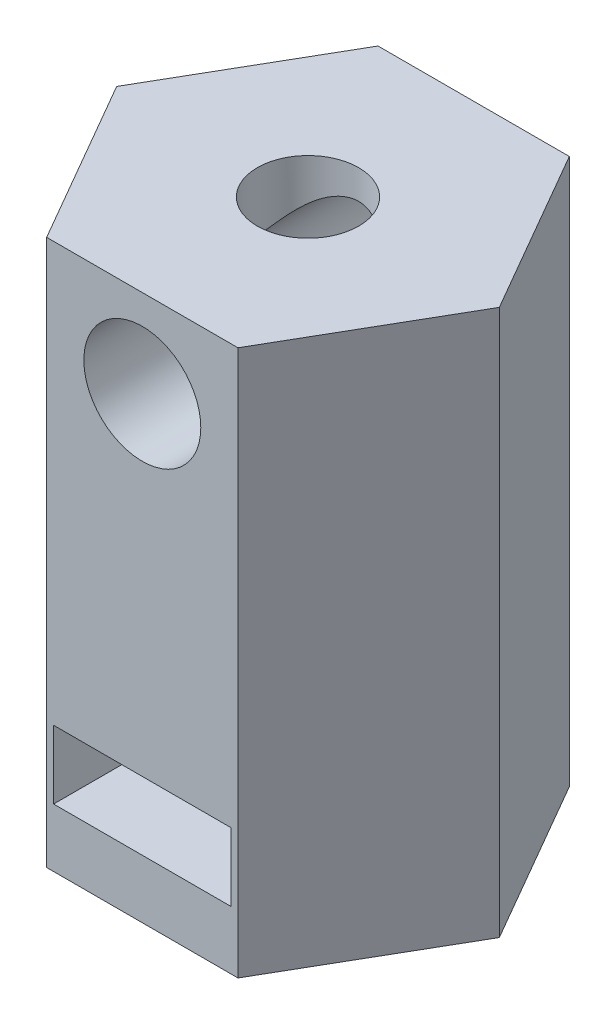
ISO-10303-21;
HEADER;
FILE_DESCRIPTION(('STEP AP214'),'2;1');
FILE_NAME('part.step','',(''),(''),'','','');
FILE_SCHEMA(('AUTOMOTIVE_DESIGN { 1 0 10303 214 1 1 1 1 }'));
ENDSEC;
DATA;
#1=APPLICATION_CONTEXT('core data for automotive mechanical design processes');
#2=APPLICATION_PROTOCOL_DEFINITION('international standard','automotive_design',2000,#1);
#3=PRODUCT_CONTEXT('',#1,'mechanical');
#4=PRODUCT('Part','Part','',(#3));
#5=PRODUCT_RELATED_PRODUCT_CATEGORY('part','',(#4));
#6=PRODUCT_DEFINITION_FORMATION('','',#4);
#7=PRODUCT_DEFINITION_CONTEXT('part definition',#1,'design');
#8=PRODUCT_DEFINITION('design','',#6,#7);
#9=PRODUCT_DEFINITION_SHAPE('','',#8);
#10=(LENGTH_UNIT() NAMED_UNIT(*) SI_UNIT(.MILLI.,.METRE.));
#11=(NAMED_UNIT(*) PLANE_ANGLE_UNIT() SI_UNIT($,.RADIAN.));
#12=(NAMED_UNIT(*) SI_UNIT($,.STERADIAN.) SOLID_ANGLE_UNIT());
#13=UNCERTAINTY_MEASURE_WITH_UNIT(LENGTH_MEASURE(1.E-05),#10,'distance_accuracy_value','');
#14=(GEOMETRIC_REPRESENTATION_CONTEXT(3) GLOBAL_UNCERTAINTY_ASSIGNED_CONTEXT((#13)) GLOBAL_UNIT_ASSIGNED_CONTEXT((#10,
#11,#12)) REPRESENTATION_CONTEXT('',''));
#15=CARTESIAN_POINT('',(0.,0.,0.));
#16=DIRECTION('',(0.,0.,1.));
#17=DIRECTION('',(1.,0.,0.));
#18=AXIS2_PLACEMENT_3D('',#15,#16,#17);
#19=CARTESIAN_POINT('',(0.,28.,0.));
#20=DIRECTION('',(0.,-1.,0.));
#21=DIRECTION('',(0.,0.,-1.));
#22=AXIS2_PLACEMENT_3D('',#19,#20,#21);
#23=CYLINDRICAL_SURFACE('',#22,2.6);
#24=CARTESIAN_POINT('',(0.,26.5,-2.6));
#25=CARTESIAN_POINT('',(-0.122036811911643,26.4999961523859,-2.59999607606496));
#26=CARTESIAN_POINT('',(-0.244101537045012,26.4924900820522,-2.59134552516133));
#27=CARTESIAN_POINT('',(-0.484127000017196,26.4631528928743,-2.55740997887854));
#28=CARTESIAN_POINT('',(-0.602084922512981,26.4413121431353,-2.53211379994141));
#29=CARTESIAN_POINT('',(-0.829866081116416,26.3853092315215,-2.46683775590036));
#30=CARTESIAN_POINT('',(-0.939734258164139,26.3512224955164,-2.42694775054569));
#31=CARTESIAN_POINT('',(-1.15015054999408,26.2730447018292,-2.33460467545643));
#32=CARTESIAN_POINT('',(-1.25069514169639,26.2289498839413,-2.28214688337876));
#33=CARTESIAN_POINT('',(-1.47814182146978,26.1147494458661,-2.14450925368009));
#34=CARTESIAN_POINT('',(-1.60035911156059,26.0411546657277,-2.05449642324004));
#35=CARTESIAN_POINT('',(-1.82474074899083,25.8851716629069,-1.85813586683931));
#36=CARTESIAN_POINT('',(-1.92685025277362,25.8027603116058,-1.75174483852135));
#37=CARTESIAN_POINT('',(-2.06588706446538,25.6762721420018,-1.58039907303505));
#38=CARTESIAN_POINT('',(-2.11027231109694,25.6331555689501,-1.52062164767831));
#39=CARTESIAN_POINT('',(-2.19381958043996,25.5471306649954,-1.39739017362985));
#40=CARTESIAN_POINT('',(-2.23298332831771,25.5042222698485,-1.33393734926688));
#41=CARTESIAN_POINT('',(-2.30597975143278,25.4197825944302,-1.20334745364668));
#42=CARTESIAN_POINT('',(-2.33982146591621,25.3782490758539,-1.13621689624653));
#43=CARTESIAN_POINT('',(-2.4020563874559,25.2979710521381,-0.997932683108461));
#44=CARTESIAN_POINT('',(-2.43045390156697,25.2592243575578,-0.926782265773632));
#45=CARTESIAN_POINT('',(-2.48252110005695,25.1849997471733,-0.776945271034018));
#46=CARTESIAN_POINT('',(-2.50594314761147,25.1497265292691,-0.698067910628427));
#47=CARTESIAN_POINT('',(-2.54566233665675,25.0877542814534,-0.535334760517547));
#48=CARTESIAN_POINT('',(-2.56197470284398,25.0610369628014,-0.451490049960404));
#49=CARTESIAN_POINT('',(-2.58459644103562,25.0232479644642,-0.292130938413231));
#50=CARTESIAN_POINT('',(-2.59202281255669,25.0104551268924,-0.217200819597414));
#51=CARTESIAN_POINT('',(-2.60026317871865,24.9962317803682,-0.0659355939648666));
#52=CARTESIAN_POINT('',(-2.60108539831342,24.9947871381768,0.0103976465192853));
#53=CARTESIAN_POINT('',(-2.59605461273043,25.0035016614558,0.162042756173804));
#54=CARTESIAN_POINT('',(-2.59020960526932,25.0136469242006,0.237355739641685));
#55=CARTESIAN_POINT('',(-2.57238021411883,25.0437484263959,0.385272909372081));
#56=CARTESIAN_POINT('',(-2.56038422559565,25.0637232079644,0.45787169607294));
#57=CARTESIAN_POINT('',(-2.52147903531039,25.1260972561526,0.645246938196866));
#58=CARTESIAN_POINT('',(-2.48994215789256,25.1746461258717,0.756961059524094));
#59=CARTESIAN_POINT('',(-2.41449561129592,25.2817234160631,0.971185557909345));
#60=CARTESIAN_POINT('',(-2.37053454874882,25.3402928815609,1.07365532204548));
#61=CARTESIAN_POINT('',(-2.28293622382989,25.4472574242365,1.24709941814335));
#62=CARTESIAN_POINT('',(-2.24165840973019,25.4948023326594,1.31980988955533));
#63=CARTESIAN_POINT('',(-2.15257193120331,25.5906278447395,1.46061089235828));
#64=CARTESIAN_POINT('',(-2.10476000509473,25.6389088050553,1.52869909084659));
#65=CARTESIAN_POINT('',(-1.95165590608276,25.7826634596901,1.72589684522945));
#66=CARTESIAN_POINT('',(-1.83651100797697,25.8772879238855,1.84830351352665));
#67=CARTESIAN_POINT('',(-1.61070902380854,26.0337235924693,2.04507047616997));
#68=CARTESIAN_POINT('',(-1.50560401122592,26.0979604036507,2.12391195012331));
#69=CARTESIAN_POINT('',(-1.28045955493203,26.2159694098807,2.26674289844214));
#70=CARTESIAN_POINT('',(-1.16044481833302,26.2697585484603,2.33075645304022));
#71=CARTESIAN_POINT('',(-0.929631725819047,26.3544881829195,2.43077509150827));
#72=CARTESIAN_POINT('',(-0.82099019255538,26.3877909054414,2.46973666437996));
#73=CARTESIAN_POINT('',(-0.596655087209226,26.4423276095791,2.53329060881113));
#74=CARTESIAN_POINT('',(-0.480965687482502,26.4635686563204,2.55789139243867));
#75=CARTESIAN_POINT('',(-0.245040719158137,26.4923456231244,2.59117793218758));
#76=CARTESIAN_POINT('',(-0.124786462895931,26.499817156763,2.59978892123352));
#77=CARTESIAN_POINT('',(0.115770972832734,26.5001760700907,2.60020326358588));
#78=CARTESIAN_POINT('',(0.236074146389205,26.4930648710206,2.59200825481378));
#79=CARTESIAN_POINT('',(0.463734828946009,26.4659908197691,2.56069448317498));
#80=CARTESIAN_POINT('',(0.571382384377745,26.4470430239618,2.53875407596919));
#81=CARTESIAN_POINT('',(0.780816061633671,26.3986014543223,2.48235729167675));
#82=CARTESIAN_POINT('',(0.882601175698396,26.3691058735604,2.44789877010923));
#83=CARTESIAN_POINT('',(1.08633193047631,26.2986422912813,2.36493538779857));
#84=CARTESIAN_POINT('',(1.18766127581577,26.2569547418623,2.31553932000514));
#85=CARTESIAN_POINT('',(1.38044374994752,26.165667928357,2.20605736786414));
#86=CARTESIAN_POINT('',(1.47188978885318,26.1160630470503,2.14596389035855));
#87=CARTESIAN_POINT('',(1.68888962334431,25.9841454608477,1.98350955968552));
#88=CARTESIAN_POINT('',(1.80786024470882,25.8981125849307,1.87528505482315));
#89=CARTESIAN_POINT('',(1.96864914876693,25.7647982796664,1.7002142562044));
#90=CARTESIAN_POINT('',(2.01937227503802,25.7195685554882,1.63962072239826));
#91=CARTESIAN_POINT('',(2.11496472200616,25.6286790912018,1.51430660737665));
#92=CARTESIAN_POINT('',(2.15983583253699,25.5830194871746,1.44958729708488));
#93=CARTESIAN_POINT('',(2.26850274418227,25.4655720858524,1.27658515611242));
#94=CARTESIAN_POINT('',(2.32786777471195,25.3942437665507,1.16510618877216));
#95=CARTESIAN_POINT('',(2.40522462408719,25.2935180885053,0.989422604012071));
#96=CARTESIAN_POINT('',(2.42904453903465,25.2610154945768,0.929512026686933));
#97=CARTESIAN_POINT('',(2.4725834993528,25.1993374633802,0.806587789475439));
#98=CARTESIAN_POINT('',(2.49230544031223,25.1701596834592,0.743576359826611));
#99=CARTESIAN_POINT('',(2.53010726734419,25.1124302973177,0.603823235786282));
#100=CARTESIAN_POINT('',(2.54741291906392,25.0847341310855,0.526503182326674));
#101=CARTESIAN_POINT('',(2.57509707486093,25.0393483416129,0.367863353352812));
#102=CARTESIAN_POINT('',(2.58549351631859,25.0216328254308,0.286554527990548));
#103=CARTESIAN_POINT('',(2.59855162561494,24.9992406415943,0.120478843716785));
#104=CARTESIAN_POINT('',(2.60112488116834,24.9947130384846,0.035683356176975));
#105=CARTESIAN_POINT('',(2.59795894640532,25.000203879138,-0.133291620194751));
#106=CARTESIAN_POINT('',(2.59221412281563,25.0102321806436,-0.217470652729842));
#107=CARTESIAN_POINT('',(2.57150348761926,25.0452584232481,-0.395891345486222));
#108=CARTESIAN_POINT('',(2.55518081870153,25.0724402758467,-0.48952128155744));
#109=CARTESIAN_POINT('',(2.51369807406109,25.1379283381528,-0.670852440277273));
#110=CARTESIAN_POINT('',(2.48850536070318,25.1762755397311,-0.758530321270102));
#111=CARTESIAN_POINT('',(2.43458226033522,25.2534849576656,-0.915798064655637));
#112=CARTESIAN_POINT('',(2.40687488243175,25.2914872739783,-0.986180314054116));
#113=CARTESIAN_POINT('',(2.34615428073661,25.3703037901942,-1.12301711282146));
#114=CARTESIAN_POINT('',(2.31313741923828,25.4111199068945,-1.18946892631223));
#115=CARTESIAN_POINT('',(2.24195527814326,25.4941496776773,-1.31874368824279));
#116=CARTESIAN_POINT('',(2.20378444829093,25.5363648008347,-1.38156261883852));
#117=CARTESIAN_POINT('',(2.12236520461423,25.6210898516541,-1.50364607092495));
#118=CARTESIAN_POINT('',(2.07911489134335,25.6635998839688,-1.56290925016452));
#119=CARTESIAN_POINT('',(1.98473519901748,25.7505972505061,-1.68133825932973));
#120=CARTESIAN_POINT('',(1.93328650493916,25.7950474789669,-1.74027868074778));
#121=CARTESIAN_POINT('',(1.82465588334032,25.882330954277,-1.85386502907448));
#122=CARTESIAN_POINT('',(1.76747380252788,25.9251641578501,-1.90851084108968));
#123=CARTESIAN_POINT('',(1.58744653263397,26.0497446078029,-2.06524649958812));
#124=CARTESIAN_POINT('',(1.45578594346458,26.1278942645975,-2.16056006403859));
#125=CARTESIAN_POINT('',(1.21182900479209,26.246668651675,-2.30330981800929));
#126=CARTESIAN_POINT('',(1.10502365217341,26.2915985533629,-2.35661013477298));
#127=CARTESIAN_POINT('',(0.881479556423296,26.3700094476502,-2.44899129880215));
#128=CARTESIAN_POINT('',(0.764753256733738,26.4035045253584,-2.48808964350416));
#129=CARTESIAN_POINT('',(0.540726854893215,26.452775309116,-2.54540014295299));
#130=CARTESIAN_POINT('',(0.434379058625082,26.4703694997917,-2.56576321666613));
#131=CARTESIAN_POINT('',(0.218694609505881,26.4939825008899,-2.59306366427572));
#132=CARTESIAN_POINT('',(0.109358512116181,26.5000034478888,-2.60000351628079));
#133=CARTESIAN_POINT('',(0.,26.5,-2.6));
#134=B_SPLINE_CURVE_WITH_KNOTS('',3,(#24,#25,#26,#27,#28,#29,#30,#31,#32,#33,#34,#35,#36,#37,
#38,#39,#40,#41,#42,#43,#44,#45,#46,#47,#48,#49,#50,#51,#52,#53,#54,#55,#56,#57,#58,#59,#60,#61,
#62,#63,#64,#65,#66,#67,#68,#69,#70,#71,#72,#73,#74,#75,#76,#77,#78,#79,#80,#81,#82,#83,#84,#85,
#86,#87,#88,#89,#90,#91,#92,#93,#94,#95,#96,#97,#98,#99,#100,#101,#102,#103,#104,#105,#106,#107,
#108,#109,#110,#111,#112,#113,#114,#115,#116,#117,#118,#119,#120,#121,#122,#123,#124,#125,#126,
#127,#128,#129,#130,#131,#132,#133),.UNSPECIFIED.,.T.,.F.,(4,2,2,2,2,2,2,2,2,2,2,2,2,2,2,2,2,2,
2,2,2,2,2,2,2,2,2,2,2,2,2,2,2,2,2,2,2,2,2,2,2,2,2,2,2,2,2,2,2,2,2,2,2,2,4),(0.,
0.365646957931043,0.731539831178044,1.09521667155394,1.45903037833673,1.96240661583991,
2.46713734287795,2.72506015258748,2.9828975331327,3.24029214474588,3.49748227649525,
3.76543730322217,4.03281567667182,4.26093801331194,4.48877619733048,4.7163413636911,
4.94433745747789,5.31967409934263,5.69658665767118,5.98478048554274,6.27311870234818,
6.84839261924972,7.28563702665712,7.72216630054766,8.0810612540919,8.43974576752274,
8.80010327992169,9.16042567335502,9.49343452539856,9.82650045218281,10.1857472196171,
10.545250009235,11.0892661384051,11.362206680241,11.635063546703,12.068718971492,
12.2851321650344,12.5013919191732,12.7524329798693,13.0028197262048,13.2560258459834,
13.5094035253937,13.8043050336667,14.1003031817671,14.3539197242193,14.6077107741024,
14.8617773417602,15.1159392206265,15.3855685776396,15.6552051455788,16.192611835933,
16.5738507362008,16.9546183277948,17.2823390441132,17.6099992529697),.UNSPECIFIED.);
#135=CARTESIAN_POINT('',(0.,26.5,-2.6));
#136=VERTEX_POINT('',#135);
#137=EDGE_CURVE('E193',#136,#136,#134,.T.);
#138=ORIENTED_EDGE('',*,*,#137,.F.);
#139=EDGE_LOOP('',(#138));
#140=FACE_BOUND('',#139,.T.);
#141=CARTESIAN_POINT('',(0.,28.,0.));
#142=DIRECTION('',(0.,1.,0.));
#143=DIRECTION('',(0.,0.,1.));
#144=AXIS2_PLACEMENT_3D('',#141,#142,#143);
#145=CIRCLE('',#144,2.6);
#146=CARTESIAN_POINT('',(0.,28.,2.6));
#147=VERTEX_POINT('',#146);
#148=EDGE_CURVE('E189',#147,#147,#145,.T.);
#149=ORIENTED_EDGE('',*,*,#148,.T.);
#150=EDGE_LOOP('',(#149));
#151=FACE_BOUND('',#150,.T.);
#152=ADVANCED_FACE('F63',(#140,#151),#23,.F.);
#153=CARTESIAN_POINT('',(-4.90747728811182,11.,8.5));
#154=DIRECTION('',(0.,0.,-1.));
#155=DIRECTION('',(-1.,0.,0.));
#156=AXIS2_PLACEMENT_3D('',#153,#154,#155);
#157=PLANE('',#156);
#158=CARTESIAN_POINT('',(0.,23.5,8.5));
#159=DIRECTION('',(0.,0.,1.));
#160=DIRECTION('',(1.,0.,0.));
#161=AXIS2_PLACEMENT_3D('',#158,#159,#160);
#162=CIRCLE('',#161,3.);
#163=CARTESIAN_POINT('',(3.,23.5,8.5));
#164=VERTEX_POINT('',#163);
#165=EDGE_CURVE('E182',#164,#164,#162,.T.);
#166=ORIENTED_EDGE('',*,*,#165,.F.);
#167=EDGE_LOOP('',(#166));
#168=FACE_BOUND('',#167,.T.);
#169=DIRECTION('',(1.,0.,0.));
#170=VECTOR('',#169,1.);
#171=CARTESIAN_POINT('',(-4.90747728811182,0.,8.5));
#172=LINE('',#171,#170);
#173=CARTESIAN_POINT('',(-4.90747728811182,0.,8.5));
#174=VERTEX_POINT('',#173);
#175=CARTESIAN_POINT('',(4.90747728811182,0.,8.5));
#176=VERTEX_POINT('',#175);
#177=EDGE_CURVE('E248',#174,#176,#172,.T.);
#178=ORIENTED_EDGE('',*,*,#177,.T.);
#179=DIRECTION('',(0.,-1.,0.));
#180=VECTOR('',#179,1.);
#181=CARTESIAN_POINT('',(4.90747728811182,11.,8.5));
#182=LINE('',#181,#180);
#183=CARTESIAN_POINT('',(4.90747728811192,28.,8.49999999999994));
#184=VERTEX_POINT('',#183);
#185=EDGE_CURVE('E250',#184,#176,#182,.T.);
#186=ORIENTED_EDGE('',*,*,#185,.F.);
#187=DIRECTION('',(1.,0.,0.));
#188=VECTOR('',#187,1.);
#189=CARTESIAN_POINT('',(-4.90747728811174,28.,8.50000000000005));
#190=LINE('',#189,#188);
#191=CARTESIAN_POINT('',(-4.90747728811174,28.,8.50000000000005));
#192=VERTEX_POINT('',#191);
#193=EDGE_CURVE('E208',#192,#184,#190,.T.);
#194=ORIENTED_EDGE('',*,*,#193,.F.);
#195=DIRECTION('',(0.,-1.,0.));
#196=VECTOR('',#195,1.);
#197=CARTESIAN_POINT('',(-4.90747728811182,11.,8.5));
#198=LINE('',#197,#196);
#199=EDGE_CURVE('E253',#192,#174,#198,.T.);
#200=ORIENTED_EDGE('',*,*,#199,.T.);
#201=EDGE_LOOP('',(#178,#186,#194,#200));
#202=FACE_BOUND('',#201,.T.);
#203=DIRECTION('',(1.,0.,0.));
#204=VECTOR('',#203,1.);
#205=CARTESIAN_POINT('',(0.,6.5,8.5));
#206=LINE('',#205,#204);
#207=CARTESIAN_POINT('',(-4.55,6.5,8.5));
#208=VERTEX_POINT('',#207);
#209=CARTESIAN_POINT('',(4.55,6.5,8.5));
#210=VERTEX_POINT('',#209);
#211=EDGE_CURVE('E212',#208,#210,#206,.T.);
#212=ORIENTED_EDGE('',*,*,#211,.T.);
#213=DIRECTION('',(0.,1.,0.));
#214=VECTOR('',#213,1.);
#215=CARTESIAN_POINT('',(4.55,0.,8.5));
#216=LINE('',#215,#214);
#217=CARTESIAN_POINT('',(4.55,3.,8.5));
#218=VERTEX_POINT('',#217);
#219=EDGE_CURVE('E221',#218,#210,#216,.T.);
#220=ORIENTED_EDGE('',*,*,#219,.F.);
#221=DIRECTION('',(-1.,0.,0.));
#222=VECTOR('',#221,1.);
#223=CARTESIAN_POINT('',(0.,3.,8.5));
#224=LINE('',#223,#222);
#225=CARTESIAN_POINT('',(-4.55,3.,8.5));
#226=VERTEX_POINT('',#225);
#227=EDGE_CURVE('E218',#218,#226,#224,.T.);
#228=ORIENTED_EDGE('',*,*,#227,.T.);
#229=DIRECTION('',(0.,1.,0.));
#230=VECTOR('',#229,1.);
#231=CARTESIAN_POINT('',(-4.55,0.,8.5));
#232=LINE('',#231,#230);
#233=EDGE_CURVE('E215',#226,#208,#232,.T.);
#234=ORIENTED_EDGE('',*,*,#233,.T.);
#235=EDGE_LOOP('',(#212,#220,#228,#234));
#236=FACE_BOUND('',#235,.T.);
#237=ADVANCED_FACE('F306',(#168,#202,#236),#157,.F.);
#238=CARTESIAN_POINT('',(0.,11.,0.));
#239=DIRECTION('',(0.,-1.,0.));
#240=DIRECTION('',(0.,0.,-1.));
#241=AXIS2_PLACEMENT_3D('',#238,#239,#240);
#242=CYLINDRICAL_SURFACE('',#241,2.6);
#243=CARTESIAN_POINT('',(0.,11.,0.));
#244=DIRECTION('',(0.,1.,0.));
#245=DIRECTION('',(0.,0.,1.));
#246=AXIS2_PLACEMENT_3D('',#243,#244,#245);
#247=CIRCLE('',#246,2.6);
#248=CARTESIAN_POINT('',(0.,11.,2.6));
#249=VERTEX_POINT('',#248);
#250=EDGE_CURVE('E211',#249,#249,#247,.T.);
#251=ORIENTED_EDGE('',*,*,#250,.T.);
#252=EDGE_LOOP('',(#251));
#253=FACE_BOUND('',#252,.T.);
#254=CARTESIAN_POINT('',(0.,6.5,0.));
#255=DIRECTION('',(0.,-1.,0.));
#256=DIRECTION('',(1.,0.,0.));
#257=AXIS2_PLACEMENT_3D('',#254,#255,#256);
#258=CIRCLE('',#257,2.6);
#259=CARTESIAN_POINT('',(2.6,6.5,0.));
#260=VERTEX_POINT('',#259);
#261=EDGE_CURVE('E237',#260,#260,#258,.T.);
#262=ORIENTED_EDGE('',*,*,#261,.T.);
#263=EDGE_LOOP('',(#262));
#264=FACE_BOUND('',#263,.T.);
#265=ADVANCED_FACE('F311',(#253,#264),#242,.F.);
#266=CARTESIAN_POINT('',(0.,0.,0.));
#267=DIRECTION('',(0.,1.,0.));
#268=DIRECTION('',(0.,0.,1.));
#269=AXIS2_PLACEMENT_3D('',#266,#267,#268);
#270=CIRCLE('',#269,2.6);
#271=CARTESIAN_POINT('',(0.,0.,2.6));
#272=VERTEX_POINT('',#271);
#273=EDGE_CURVE('E233',#272,#272,#270,.T.);
#274=ORIENTED_EDGE('',*,*,#273,.F.);
#275=EDGE_LOOP('',(#274));
#276=FACE_BOUND('',#275,.T.);
#277=CARTESIAN_POINT('',(0.,3.,0.));
#278=DIRECTION('',(0.,1.,0.));
#279=DIRECTION('',(-1.,0.,0.));
#280=AXIS2_PLACEMENT_3D('',#277,#278,#279);
#281=CIRCLE('',#280,2.6);
#282=CARTESIAN_POINT('',(-2.6,3.,0.));
#283=VERTEX_POINT('',#282);
#284=EDGE_CURVE('E226',#283,#283,#281,.T.);
#285=ORIENTED_EDGE('',*,*,#284,.T.);
#286=EDGE_LOOP('',(#285));
#287=FACE_BOUND('',#286,.T.);
#288=ADVANCED_FACE('F360',(#276,#287),#242,.F.);
#289=CARTESIAN_POINT('',(0.,0.,0.));
#290=DIRECTION('',(0.,1.,0.));
#291=DIRECTION('',(0.,0.,1.));
#292=AXIS2_PLACEMENT_3D('',#289,#290,#291);
#293=PLANE('',#292);
#294=DIRECTION('',(0.5,0.,-0.866025403784439));
#295=VECTOR('',#294,1.);
#296=CARTESIAN_POINT('',(4.90747728811182,0.,8.5));
#297=LINE('',#296,#295);
#298=CARTESIAN_POINT('',(9.81495457622364,0.,0.));
#299=VERTEX_POINT('',#298);
#300=EDGE_CURVE('E236',#176,#299,#297,.T.);
#301=ORIENTED_EDGE('',*,*,#300,.F.);
#302=ORIENTED_EDGE('',*,*,#177,.F.);
#303=DIRECTION('',(0.5,0.,0.866025403784439));
#304=VECTOR('',#303,1.);
#305=CARTESIAN_POINT('',(-9.81495457622364,0.,0.));
#306=LINE('',#305,#304);
#307=CARTESIAN_POINT('',(-9.81495457622364,0.,0.));
#308=VERTEX_POINT('',#307);
#309=EDGE_CURVE('E246',#308,#174,#306,.T.);
#310=ORIENTED_EDGE('',*,*,#309,.F.);
#311=DIRECTION('',(-0.5,0.,0.866025403784439));
#312=VECTOR('',#311,1.);
#313=CARTESIAN_POINT('',(-4.90747728811182,0.,-8.5));
#314=LINE('',#313,#312);
#315=CARTESIAN_POINT('',(-4.90747728811182,0.,-8.5));
#316=VERTEX_POINT('',#315);
#317=EDGE_CURVE('E244',#316,#308,#314,.T.);
#318=ORIENTED_EDGE('',*,*,#317,.F.);
#319=DIRECTION('',(-1.,0.,0.));
#320=VECTOR('',#319,1.);
#321=CARTESIAN_POINT('',(4.90747728811182,0.,-8.5));
#322=LINE('',#321,#320);
#323=CARTESIAN_POINT('',(4.90747728811182,0.,-8.5));
#324=VERTEX_POINT('',#323);
#325=EDGE_CURVE('E242',#324,#316,#322,.T.);
#326=ORIENTED_EDGE('',*,*,#325,.F.);
#327=DIRECTION('',(-0.5,0.,-0.866025403784438));
#328=VECTOR('',#327,1.);
#329=CARTESIAN_POINT('',(9.81495457622364,0.,0.));
#330=LINE('',#329,#328);
#331=EDGE_CURVE('E240',#299,#324,#330,.T.);
#332=ORIENTED_EDGE('',*,*,#331,.F.);
#333=EDGE_LOOP('',(#301,#302,#310,#318,#326,#332));
#334=FACE_BOUND('',#333,.T.);
#335=ORIENTED_EDGE('',*,*,#273,.T.);
#336=EDGE_LOOP('',(#335));
#337=FACE_BOUND('',#336,.T.);
#338=ADVANCED_FACE('F362',(#334,#337),#293,.F.);
#339=CARTESIAN_POINT('',(4.90747728811182,11.,8.5));
#340=DIRECTION('',(-0.866025403784439,0.,-0.5));
#341=DIRECTION('',(-0.5,0.,0.866025403784439));
#342=AXIS2_PLACEMENT_3D('',#339,#340,#341);
#343=PLANE('',#342);
#344=ORIENTED_EDGE('',*,*,#300,.T.);
#345=DIRECTION('',(0.,-1.,0.));
#346=VECTOR('',#345,1.);
#347=CARTESIAN_POINT('',(9.81495457622364,11.,0.));
#348=LINE('',#347,#346);
#349=CARTESIAN_POINT('',(9.81495457622364,28.,0.));
#350=VERTEX_POINT('',#349);
#351=EDGE_CURVE('E265',#350,#299,#348,.T.);
#352=ORIENTED_EDGE('',*,*,#351,.F.);
#353=DIRECTION('',(0.499999999999995,0.,-0.866025403784442));
#354=VECTOR('',#353,1.);
#355=CARTESIAN_POINT('',(4.90747728811192,28.,8.49999999999994));
#356=LINE('',#355,#354);
#357=EDGE_CURVE('E192',#184,#350,#356,.T.);
#358=ORIENTED_EDGE('',*,*,#357,.F.);
#359=ORIENTED_EDGE('',*,*,#185,.T.);
#360=EDGE_LOOP('',(#344,#352,#358,#359));
#361=FACE_BOUND('',#360,.T.);
#362=ADVANCED_FACE('F65',(#361),#343,.F.);
#363=CARTESIAN_POINT('',(9.81495457622364,11.,0.));
#364=DIRECTION('',(-0.866025403784439,0.,0.5));
#365=DIRECTION('',(0.5,0.,0.866025403784439));
#366=AXIS2_PLACEMENT_3D('',#363,#364,#365);
#367=PLANE('',#366);
#368=ORIENTED_EDGE('',*,*,#331,.T.);
#369=DIRECTION('',(0.,-1.,0.));
#370=VECTOR('',#369,1.);
#371=CARTESIAN_POINT('',(4.90747728811182,11.,-8.5));
#372=LINE('',#371,#370);
#373=CARTESIAN_POINT('',(4.9074772881118,28.,-8.50000000000001));
#374=VERTEX_POINT('',#373);
#375=EDGE_CURVE('E262',#374,#324,#372,.T.);
#376=ORIENTED_EDGE('',*,*,#375,.F.);
#377=DIRECTION('',(-0.500000000000001,0.,-0.866025403784438));
#378=VECTOR('',#377,1.);
#379=CARTESIAN_POINT('',(9.81495457622364,28.,0.));
#380=LINE('',#379,#378);
#381=EDGE_CURVE('E196',#350,#374,#380,.T.);
#382=ORIENTED_EDGE('',*,*,#381,.F.);
#383=ORIENTED_EDGE('',*,*,#351,.T.);
#384=EDGE_LOOP('',(#368,#376,#382,#383));
#385=FACE_BOUND('',#384,.T.);
#386=ADVANCED_FACE('F375',(#385),#367,.F.);
#387=CARTESIAN_POINT('',(4.90747728811182,11.,-8.5));
#388=DIRECTION('',(0.,0.,1.));
#389=DIRECTION('',(1.,0.,0.));
#390=AXIS2_PLACEMENT_3D('',#387,#388,#389);
#391=PLANE('',#390);
#392=CARTESIAN_POINT('',(0.,23.5,-8.50000000000001));
#393=DIRECTION('',(0.,0.,1.));
#394=DIRECTION('',(1.,0.,0.));
#395=AXIS2_PLACEMENT_3D('',#392,#393,#394);
#396=CIRCLE('',#395,3.);
#397=CARTESIAN_POINT('',(3.,23.5,-8.50000000000001));
#398=VERTEX_POINT('',#397);
#399=EDGE_CURVE('E183',#398,#398,#396,.T.);
#400=ORIENTED_EDGE('',*,*,#399,.T.);
#401=EDGE_LOOP('',(#400));
#402=FACE_BOUND('',#401,.T.);
#403=ORIENTED_EDGE('',*,*,#325,.T.);
#404=DIRECTION('',(0.,-1.,0.));
#405=VECTOR('',#404,1.);
#406=CARTESIAN_POINT('',(-4.90747728811182,11.,-8.5));
#407=LINE('',#406,#405);
#408=CARTESIAN_POINT('',(-4.90747728811186,28.,-8.49999999999998));
#409=VERTEX_POINT('',#408);
#410=EDGE_CURVE('E259',#409,#316,#407,.T.);
#411=ORIENTED_EDGE('',*,*,#410,.F.);
#412=DIRECTION('',(-1.,0.,0.));
#413=VECTOR('',#412,1.);
#414=CARTESIAN_POINT('',(4.9074772881118,28.,-8.50000000000001));
#415=LINE('',#414,#413);
#416=EDGE_CURVE('E199',#374,#409,#415,.T.);
#417=ORIENTED_EDGE('',*,*,#416,.F.);
#418=ORIENTED_EDGE('',*,*,#375,.T.);
#419=EDGE_LOOP('',(#403,#411,#417,#418));
#420=FACE_BOUND('',#419,.T.);
#421=ADVANCED_FACE('F372',(#402,#420),#391,.F.);
#422=CARTESIAN_POINT('',(-4.90747728811182,11.,-8.5));
#423=DIRECTION('',(0.866025403784439,0.,0.5));
#424=DIRECTION('',(0.5,0.,-0.866025403784439));
#425=AXIS2_PLACEMENT_3D('',#422,#423,#424);
#426=PLANE('',#425);
#427=ORIENTED_EDGE('',*,*,#317,.T.);
#428=DIRECTION('',(0.,-1.,0.));
#429=VECTOR('',#428,1.);
#430=CARTESIAN_POINT('',(-9.81495457622364,11.,0.));
#431=LINE('',#430,#429);
#432=CARTESIAN_POINT('',(-9.81495457622364,28.,0.));
#433=VERTEX_POINT('',#432);
#434=EDGE_CURVE('E256',#433,#308,#431,.T.);
#435=ORIENTED_EDGE('',*,*,#434,.F.);
#436=DIRECTION('',(-0.499999999999995,0.,0.866025403784442));
#437=VECTOR('',#436,1.);
#438=CARTESIAN_POINT('',(-4.90747728811186,28.,-8.49999999999998));
#439=LINE('',#438,#437);
#440=EDGE_CURVE('E202',#409,#433,#439,.T.);
#441=ORIENTED_EDGE('',*,*,#440,.F.);
#442=ORIENTED_EDGE('',*,*,#410,.T.);
#443=EDGE_LOOP('',(#427,#435,#441,#442));
#444=FACE_BOUND('',#443,.T.);
#445=ADVANCED_FACE('F368',(#444),#426,.F.);
#446=CARTESIAN_POINT('',(-9.81495457622364,11.,0.));
#447=DIRECTION('',(0.866025403784438,0.,-0.5));
#448=DIRECTION('',(-0.5,0.,-0.866025403784439));
#449=AXIS2_PLACEMENT_3D('',#446,#447,#448);
#450=PLANE('',#449);
#451=ORIENTED_EDGE('',*,*,#309,.T.);
#452=ORIENTED_EDGE('',*,*,#199,.F.);
#453=DIRECTION('',(0.500000000000007,0.,0.866025403784434));
#454=VECTOR('',#453,1.);
#455=CARTESIAN_POINT('',(-9.81495457622364,28.,0.));
#456=LINE('',#455,#454);
#457=EDGE_CURVE('E205',#433,#192,#456,.T.);
#458=ORIENTED_EDGE('',*,*,#457,.F.);
#459=ORIENTED_EDGE('',*,*,#434,.T.);
#460=EDGE_LOOP('',(#451,#452,#458,#459));
#461=FACE_BOUND('',#460,.T.);
#462=ADVANCED_FACE('F357',(#461),#450,.F.);
#463=CARTESIAN_POINT('',(0.,6.5,-5.69999999999999));
#464=DIRECTION('',(0.,-1.,0.));
#465=DIRECTION('',(1.,0.,0.));
#466=AXIS2_PLACEMENT_3D('',#463,#464,#465);
#467=PLANE('',#466);
#468=DIRECTION('',(0.499999999999995,0.,0.866025403784442));
#469=VECTOR('',#468,1.);
#470=CARTESIAN_POINT('',(3.41250000000002,6.5,-1.97020779360958));
#471=LINE('',#470,#469);
#472=CARTESIAN_POINT('',(2.27500000000004,6.5,-3.94041558721917));
#473=VERTEX_POINT('',#472);
#474=CARTESIAN_POINT('',(4.55,6.5,0.));
#475=VERTEX_POINT('',#474);
#476=EDGE_CURVE('E163',#473,#475,#471,.T.);
#477=ORIENTED_EDGE('',*,*,#476,.T.);
#478=DIRECTION('',(0.,0.,1.));
#479=VECTOR('',#478,1.);
#480=CARTESIAN_POINT('',(4.55,6.5,-5.69999999999999));
#481=LINE('',#480,#479);
#482=EDGE_CURVE('E224',#475,#210,#481,.T.);
#483=ORIENTED_EDGE('',*,*,#482,.T.);
#484=ORIENTED_EDGE('',*,*,#211,.F.);
#485=DIRECTION('',(0.,0.,1.));
#486=VECTOR('',#485,1.);
#487=CARTESIAN_POINT('',(-4.55,6.5,-5.69999999999999));
#488=LINE('',#487,#486);
#489=CARTESIAN_POINT('',(-4.55,6.5,0.));
#490=VERTEX_POINT('',#489);
#491=EDGE_CURVE('E223',#490,#208,#488,.T.);
#492=ORIENTED_EDGE('',*,*,#491,.F.);
#493=DIRECTION('',(0.500000000000007,0.,-0.866025403784435));
#494=VECTOR('',#493,1.);
#495=CARTESIAN_POINT('',(-3.41249999999998,6.5,-1.97020779360962));
#496=LINE('',#495,#494);
#497=CARTESIAN_POINT('',(-2.27499999999996,6.5,-3.94041558721921));
#498=VERTEX_POINT('',#497);
#499=EDGE_CURVE('E172',#490,#498,#496,.T.);
#500=ORIENTED_EDGE('',*,*,#499,.T.);
#501=DIRECTION('',(1.,0.,0.));
#502=VECTOR('',#501,1.);
#503=CARTESIAN_POINT('',(0.,6.5,-3.94041558721919));
#504=LINE('',#503,#502);
#505=EDGE_CURVE('E157',#498,#473,#504,.T.);
#506=ORIENTED_EDGE('',*,*,#505,.T.);
#507=EDGE_LOOP('',(#477,#483,#484,#492,#500,#506));
#508=FACE_BOUND('',#507,.T.);
#509=ORIENTED_EDGE('',*,*,#261,.F.);
#510=EDGE_LOOP('',(#509));
#511=FACE_BOUND('',#510,.T.);
#512=ADVANCED_FACE('F169',(#508,#511),#467,.T.);
#513=CARTESIAN_POINT('',(-4.55,0.,-5.69999999999999));
#514=DIRECTION('',(1.,0.,0.));
#515=DIRECTION('',(0.,1.,0.));
#516=AXIS2_PLACEMENT_3D('',#513,#514,#515);
#517=PLANE('',#516);
#518=DIRECTION('',(0.,1.,0.));
#519=VECTOR('',#518,1.);
#520=CARTESIAN_POINT('',(-4.55,0.,0.));
#521=LINE('',#520,#519);
#522=CARTESIAN_POINT('',(-4.55,3.,0.));
#523=VERTEX_POINT('',#522);
#524=EDGE_CURVE('E177',#523,#490,#521,.T.);
#525=ORIENTED_EDGE('',*,*,#524,.T.);
#526=ORIENTED_EDGE('',*,*,#491,.T.);
#527=ORIENTED_EDGE('',*,*,#233,.F.);
#528=DIRECTION('',(0.,0.,1.));
#529=VECTOR('',#528,1.);
#530=CARTESIAN_POINT('',(-4.55,3.,-5.69999999999999));
#531=LINE('',#530,#529);
#532=EDGE_CURVE('E228',#523,#226,#531,.T.);
#533=ORIENTED_EDGE('',*,*,#532,.F.);
#534=EDGE_LOOP('',(#525,#526,#527,#533));
#535=FACE_BOUND('',#534,.T.);
#536=ADVANCED_FACE('F348',(#535),#517,.T.);
#537=CARTESIAN_POINT('',(0.,3.,-5.69999999999999));
#538=DIRECTION('',(0.,1.,0.));
#539=DIRECTION('',(-1.,0.,0.));
#540=AXIS2_PLACEMENT_3D('',#537,#538,#539);
#541=PLANE('',#540);
#542=DIRECTION('',(0.499999999999995,0.,0.866025403784442));
#543=VECTOR('',#542,1.);
#544=CARTESIAN_POINT('',(0.94432759921439,3.,-6.24520779360961));
#545=LINE('',#544,#543);
#546=CARTESIAN_POINT('',(2.27500000000004,3.,-3.94041558721917));
#547=VERTEX_POINT('',#546);
#548=CARTESIAN_POINT('',(4.55,3.,0.));
#549=VERTEX_POINT('',#548);
#550=EDGE_CURVE('E78',#547,#549,#545,.T.);
#551=ORIENTED_EDGE('',*,*,#550,.F.);
#552=DIRECTION('',(1.,0.,0.));
#553=VECTOR('',#552,1.);
#554=CARTESIAN_POINT('',(0.,3.,-3.94041558721919));
#555=LINE('',#554,#553);
#556=CARTESIAN_POINT('',(-2.27499999999996,3.,-3.94041558721921));
#557=VERTEX_POINT('',#556);
#558=EDGE_CURVE('E12',#557,#547,#555,.T.);
#559=ORIENTED_EDGE('',*,*,#558,.F.);
#560=DIRECTION('',(0.500000000000007,0.,-0.866025403784435));
#561=VECTOR('',#560,1.);
#562=CARTESIAN_POINT('',(-0.944327599214309,3.,-6.24520779360958));
#563=LINE('',#562,#561);
#564=EDGE_CURVE('E71',#523,#557,#563,.T.);
#565=ORIENTED_EDGE('',*,*,#564,.F.);
#566=ORIENTED_EDGE('',*,*,#532,.T.);
#567=ORIENTED_EDGE('',*,*,#227,.F.);
#568=DIRECTION('',(0.,0.,1.));
#569=VECTOR('',#568,1.);
#570=CARTESIAN_POINT('',(4.55,3.,-5.69999999999999));
#571=LINE('',#570,#569);
#572=EDGE_CURVE('E85',#549,#218,#571,.T.);
#573=ORIENTED_EDGE('',*,*,#572,.F.);
#574=EDGE_LOOP('',(#551,#559,#565,#566,#567,#573));
#575=FACE_BOUND('',#574,.T.);
#576=ORIENTED_EDGE('',*,*,#284,.F.);
#577=EDGE_LOOP('',(#576));
#578=FACE_BOUND('',#577,.T.);
#579=ADVANCED_FACE('F340',(#575,#578),#541,.T.);
#580=CARTESIAN_POINT('',(4.55,0.,-5.69999999999999));
#581=DIRECTION('',(1.,0.,0.));
#582=DIRECTION('',(0.,1.,0.));
#583=AXIS2_PLACEMENT_3D('',#580,#581,#582);
#584=PLANE('',#583);
#585=ORIENTED_EDGE('',*,*,#482,.F.);
#586=DIRECTION('',(0.,1.,0.));
#587=VECTOR('',#586,1.);
#588=CARTESIAN_POINT('',(4.55,0.,0.));
#589=LINE('',#588,#587);
#590=EDGE_CURVE('E165',#549,#475,#589,.T.);
#591=ORIENTED_EDGE('',*,*,#590,.F.);
#592=ORIENTED_EDGE('',*,*,#572,.T.);
#593=ORIENTED_EDGE('',*,*,#219,.T.);
#594=EDGE_LOOP('',(#585,#591,#592,#593));
#595=FACE_BOUND('',#594,.T.);
#596=ADVANCED_FACE('F337',(#595),#584,.F.);
#597=CARTESIAN_POINT('',(0.,11.,0.));
#598=DIRECTION('',(0.,1.,0.));
#599=DIRECTION('',(0.,0.,1.));
#600=AXIS2_PLACEMENT_3D('',#597,#598,#599);
#601=PLANE('',#600);
#602=ORIENTED_EDGE('',*,*,#250,.F.);
#603=EDGE_LOOP('',(#602));
#604=FACE_BOUND('',#603,.T.);
#605=ADVANCED_FACE('F339',(#604),#601,.F.);
#606=CARTESIAN_POINT('',(0.,28.,0.));
#607=DIRECTION('',(0.,1.,0.));
#608=DIRECTION('',(0.,0.,1.));
#609=AXIS2_PLACEMENT_3D('',#606,#607,#608);
#610=PLANE('',#609);
#611=ORIENTED_EDGE('',*,*,#357,.T.);
#612=ORIENTED_EDGE('',*,*,#381,.T.);
#613=ORIENTED_EDGE('',*,*,#416,.T.);
#614=ORIENTED_EDGE('',*,*,#440,.T.);
#615=ORIENTED_EDGE('',*,*,#457,.T.);
#616=ORIENTED_EDGE('',*,*,#193,.T.);
#617=EDGE_LOOP('',(#611,#612,#613,#614,#615,#616));
#618=FACE_BOUND('',#617,.T.);
#619=ORIENTED_EDGE('',*,*,#148,.F.);
#620=EDGE_LOOP('',(#619));
#621=FACE_BOUND('',#620,.T.);
#622=ADVANCED_FACE('F293',(#618,#621),#610,.T.);
#623=CARTESIAN_POINT('',(0.,23.5,-8.50000000000001));
#624=DIRECTION('',(0.,0.,1.));
#625=DIRECTION('',(1.,0.,0.));
#626=AXIS2_PLACEMENT_3D('',#623,#624,#625);
#627=CYLINDRICAL_SURFACE('',#626,3.);
#628=ORIENTED_EDGE('',*,*,#137,.T.);
#629=EDGE_LOOP('',(#628));
#630=FACE_BOUND('',#629,.T.);
#631=CARTESIAN_POINT('',(0.,20.5,-2.6));
#632=CARTESIAN_POINT('',(0.122036811911643,20.5000038476141,-2.59999607606496));
#633=CARTESIAN_POINT('',(0.244101537045012,20.5075099179478,-2.59134552516133));
#634=CARTESIAN_POINT('',(0.484127000017196,20.5368471071257,-2.55740997887854));
#635=CARTESIAN_POINT('',(0.602084922512981,20.5586878568647,-2.53211379994141));
#636=CARTESIAN_POINT('',(0.829866081116416,20.6146907684785,-2.46683775590036));
#637=CARTESIAN_POINT('',(0.939734258164139,20.6487775044836,-2.42694775054569));
#638=CARTESIAN_POINT('',(1.15015054999408,20.7269552981708,-2.33460467545643));
#639=CARTESIAN_POINT('',(1.25069514169639,20.7710501160587,-2.28214688337876));
#640=CARTESIAN_POINT('',(1.47814182146978,20.8852505541339,-2.14450925368009));
#641=CARTESIAN_POINT('',(1.60035911156059,20.9588453342723,-2.05449642324004));
#642=CARTESIAN_POINT('',(1.82474074899083,21.1148283370931,-1.85813586683931));
#643=CARTESIAN_POINT('',(1.92685025277362,21.1972396883942,-1.75174483852135));
#644=CARTESIAN_POINT('',(2.06588706446538,21.3237278579982,-1.58039907303505));
#645=CARTESIAN_POINT('',(2.11027231109694,21.3668444310499,-1.52062164767831));
#646=CARTESIAN_POINT('',(2.19381958043996,21.4528693350046,-1.39739017362985));
#647=CARTESIAN_POINT('',(2.23298332831771,21.4957777301515,-1.33393734926688));
#648=CARTESIAN_POINT('',(2.30597975143278,21.5802174055698,-1.20334745364668));
#649=CARTESIAN_POINT('',(2.33982146591621,21.6217509241461,-1.13621689624653));
#650=CARTESIAN_POINT('',(2.4020563874559,21.7020289478619,-0.99793268310846));
#651=CARTESIAN_POINT('',(2.43045390156697,21.7407756424422,-0.926782265773631));
#652=CARTESIAN_POINT('',(2.48252110005695,21.8150002528267,-0.776945271034019));
#653=CARTESIAN_POINT('',(2.50594314761147,21.8502734707309,-0.698067910628428));
#654=CARTESIAN_POINT('',(2.54566233665675,21.9122457185466,-0.535334760517549));
#655=CARTESIAN_POINT('',(2.56197470284398,21.9389630371986,-0.451490049960405));
#656=CARTESIAN_POINT('',(2.58459644103562,21.9767520355358,-0.292130938413232));
#657=CARTESIAN_POINT('',(2.59202281255669,21.9895448731076,-0.217200819597416));
#658=CARTESIAN_POINT('',(2.60026317871865,22.0037682196318,-0.0659355939648685));
#659=CARTESIAN_POINT('',(2.60108539831342,22.0052128618232,0.0103976465192834));
#660=CARTESIAN_POINT('',(2.59605461273043,21.9964983385442,0.162042756173802));
#661=CARTESIAN_POINT('',(2.59020960526932,21.9863530757994,0.237355739641682));
#662=CARTESIAN_POINT('',(2.57238021411883,21.9562515736041,0.385272909372079));
#663=CARTESIAN_POINT('',(2.56038422559565,21.9362767920355,0.457871696072938));
#664=CARTESIAN_POINT('',(2.52147903531039,21.8739027438474,0.645246938196865));
#665=CARTESIAN_POINT('',(2.48994215789256,21.8253538741283,0.756961059524092));
#666=CARTESIAN_POINT('',(2.41449561129592,21.7182765839369,0.971185557909343));
#667=CARTESIAN_POINT('',(2.37053454874882,21.6597071184391,1.07365532204548));
#668=CARTESIAN_POINT('',(2.28293622382989,21.5527425757635,1.24709941814334));
#669=CARTESIAN_POINT('',(2.2416584097302,21.5051976673406,1.31980988955533));
#670=CARTESIAN_POINT('',(2.15257193120332,21.4093721552605,1.46061089235828));
#671=CARTESIAN_POINT('',(2.10476000509473,21.3610911949447,1.52869909084659));
#672=CARTESIAN_POINT('',(1.95165590608276,21.2173365403099,1.72589684522945));
#673=CARTESIAN_POINT('',(1.83651100797697,21.1227120761145,1.84830351352664));
#674=CARTESIAN_POINT('',(1.61070902380854,20.9662764075307,2.04507047616996));
#675=CARTESIAN_POINT('',(1.50560401122593,20.9020395963493,2.1239119501233));
#676=CARTESIAN_POINT('',(1.28045955493204,20.7840305901193,2.26674289844214));
#677=CARTESIAN_POINT('',(1.16044481833302,20.7302414515397,2.33075645304022));
#678=CARTESIAN_POINT('',(0.92963172581905,20.6455118170805,2.43077509150826));
#679=CARTESIAN_POINT('',(0.820990192555384,20.6122090945586,2.46973666437996));
#680=CARTESIAN_POINT('',(0.596655087209229,20.5576723904209,2.53329060881113));
#681=CARTESIAN_POINT('',(0.480965687482505,20.5364313436796,2.55789139243867));
#682=CARTESIAN_POINT('',(0.245040719158139,20.5076543768756,2.59117793218758));
#683=CARTESIAN_POINT('',(0.124786462895933,20.500182843237,2.59978892123352));
#684=CARTESIAN_POINT('',(-0.115770972832732,20.4998239299093,2.60020326358588));
#685=CARTESIAN_POINT('',(-0.236074146389203,20.5069351289794,2.59200825481378));
#686=CARTESIAN_POINT('',(-0.463734828946009,20.5340091802309,2.56069448317498));
#687=CARTESIAN_POINT('',(-0.571382384377745,20.5529569760382,2.53875407596919));
#688=CARTESIAN_POINT('',(-0.780816061633671,20.6013985456777,2.48235729167675));
#689=CARTESIAN_POINT('',(-0.882601175698397,20.6308941264396,2.44789877010923));
#690=CARTESIAN_POINT('',(-1.08633193047631,20.7013577087187,2.36493538779857));
#691=CARTESIAN_POINT('',(-1.18766127581577,20.7430452581377,2.31553932000514));
#692=CARTESIAN_POINT('',(-1.38044374994752,20.834332071643,2.20605736786414));
#693=CARTESIAN_POINT('',(-1.47188978885318,20.8839369529497,2.14596389035855));
#694=CARTESIAN_POINT('',(-1.68888962334431,21.0158545391523,1.98350955968552));
#695=CARTESIAN_POINT('',(-1.80786024470882,21.1018874150693,1.87528505482315));
#696=CARTESIAN_POINT('',(-1.96864914876693,21.2352017203336,1.7002142562044));
#697=CARTESIAN_POINT('',(-2.01937227503802,21.2804314445118,1.63962072239826));
#698=CARTESIAN_POINT('',(-2.11496472200616,21.3713209087982,1.51430660737665));
#699=CARTESIAN_POINT('',(-2.15983583253699,21.4169805128254,1.44958729708488));
#700=CARTESIAN_POINT('',(-2.26850274418227,21.5344279141476,1.27658515611242));
#701=CARTESIAN_POINT('',(-2.32786777471195,21.6057562334493,1.16510618877216));
#702=CARTESIAN_POINT('',(-2.40522462408719,21.7064819114947,0.989422604012071));
#703=CARTESIAN_POINT('',(-2.42904453903465,21.7389845054232,0.929512026686932));
#704=CARTESIAN_POINT('',(-2.4725834993528,21.8006625366198,0.806587789475438));
#705=CARTESIAN_POINT('',(-2.49230544031223,21.8298403165408,0.74357635982661));
#706=CARTESIAN_POINT('',(-2.53010726734419,21.8875697026823,0.60382323578628));
#707=CARTESIAN_POINT('',(-2.54741291906392,21.9152658689145,0.526503182326672));
#708=CARTESIAN_POINT('',(-2.57509707486093,21.9606516583871,0.36786335335281));
#709=CARTESIAN_POINT('',(-2.58549351631859,21.9783671745692,0.286554527990545));
#710=CARTESIAN_POINT('',(-2.59855162561494,22.0007593584057,0.120478843716781));
#711=CARTESIAN_POINT('',(-2.60112488116834,22.0052869615154,0.0356833561769711));
#712=CARTESIAN_POINT('',(-2.59795894640532,21.999796120862,-0.133291620194755));
#713=CARTESIAN_POINT('',(-2.59221412281563,21.9897678193564,-0.217470652729847));
#714=CARTESIAN_POINT('',(-2.57150348761926,21.9547415767519,-0.395891345486228));
#715=CARTESIAN_POINT('',(-2.55518081870153,21.9275597241533,-0.489521281557447));
#716=CARTESIAN_POINT('',(-2.51369807406109,21.8620716618472,-0.670852440277281));
#717=CARTESIAN_POINT('',(-2.48850536070317,21.8237244602689,-0.75853032127011));
#718=CARTESIAN_POINT('',(-2.43458226033521,21.7465150423344,-0.915798064655645));
#719=CARTESIAN_POINT('',(-2.40687488243174,21.7085127260217,-0.986180314054124));
#720=CARTESIAN_POINT('',(-2.34615428073661,21.6296962098058,-1.12301711282147));
#721=CARTESIAN_POINT('',(-2.31313741923827,21.5888800931054,-1.18946892631224));
#722=CARTESIAN_POINT('',(-2.24195527814325,21.5058503223227,-1.3187436882428));
#723=CARTESIAN_POINT('',(-2.20378444829092,21.4636351991653,-1.38156261883853));
#724=CARTESIAN_POINT('',(-2.12236520461422,21.3789101483459,-1.50364607092496));
#725=CARTESIAN_POINT('',(-2.07911489134334,21.3364001160312,-1.56290925016453));
#726=CARTESIAN_POINT('',(-1.98473519901748,21.2494027494939,-1.68133825932974));
#727=CARTESIAN_POINT('',(-1.93328650493915,21.2049525210331,-1.74027868074779));
#728=CARTESIAN_POINT('',(-1.82465588334031,21.117669045723,-1.85386502907449));
#729=CARTESIAN_POINT('',(-1.76747380252787,21.0748358421499,-1.90851084108969));
#730=CARTESIAN_POINT('',(-1.58744653263396,20.9502553921971,-2.06524649958813));
#731=CARTESIAN_POINT('',(-1.45578594346457,20.8721057354025,-2.1605600640386));
#732=CARTESIAN_POINT('',(-1.21182900479207,20.7533313483249,-2.3033098180093));
#733=CARTESIAN_POINT('',(-1.10502365217339,20.7084014466371,-2.35661013477298));
#734=CARTESIAN_POINT('',(-0.881479556423281,20.6299905523498,-2.44899129880215));
#735=CARTESIAN_POINT('',(-0.764753256733721,20.5964954746415,-2.48808964350417));
#736=CARTESIAN_POINT('',(-0.5407268548932,20.547224690884,-2.54540014295299));
#737=CARTESIAN_POINT('',(-0.43437905862507,20.5296305002083,-2.56576321666613));
#738=CARTESIAN_POINT('',(-0.218694609505875,20.50601749911,-2.59306366427572));
#739=CARTESIAN_POINT('',(-0.109358512116178,20.4999965521112,-2.60000351628079));
#740=CARTESIAN_POINT('',(0.,20.5,-2.6));
#741=B_SPLINE_CURVE_WITH_KNOTS('',3,(#631,#632,#633,#634,#635,#636,#637,#638,#639,#640,#641,
#642,#643,#644,#645,#646,#647,#648,#649,#650,#651,#652,#653,#654,#655,#656,#657,#658,#659,#660,
#661,#662,#663,#664,#665,#666,#667,#668,#669,#670,#671,#672,#673,#674,#675,#676,#677,#678,#679,
#680,#681,#682,#683,#684,#685,#686,#687,#688,#689,#690,#691,#692,#693,#694,#695,#696,#697,#698,
#699,#700,#701,#702,#703,#704,#705,#706,#707,#708,#709,#710,#711,#712,#713,#714,#715,#716,#717,
#718,#719,#720,#721,#722,#723,#724,#725,#726,#727,#728,#729,#730,#731,#732,#733,#734,#735,#736,
#737,#738,#739,#740),.UNSPECIFIED.,.T.,.F.,(4,2,2,2,2,2,2,2,2,2,2,2,2,2,2,2,2,2,2,2,2,2,2,2,2,2,
2,2,2,2,2,2,2,2,2,2,2,2,2,2,2,2,2,2,2,2,2,2,2,2,2,2,2,2,4),(0.,0.365646957931043,
0.731539831178044,1.09521667155394,1.45903037833673,1.96240661583991,2.46713734287795,
2.72506015258748,2.9828975331327,3.24029214474589,3.49748227649526,3.76543730322217,
4.03281567667182,4.26093801331194,4.48877619733048,4.7163413636911,4.94433745747789,
5.31967409934263,5.69658665767118,5.98478048554274,6.27311870234818,6.84839261924972,
7.28563702665711,7.72216630054766,8.0810612540919,8.43974576752274,8.80010327992169,
9.16042567335502,9.49343452539856,9.82650045218281,10.1857472196171,10.545250009235,
11.0892661384051,11.362206680241,11.635063546703,12.068718971492,12.2851321650344,
12.5013919191732,12.7524329798693,13.0028197262048,13.2560258459834,13.5094035253938,
13.8043050336667,14.1003031817671,14.3539197242193,14.6077107741024,14.8617773417602,
15.1159392206265,15.3855685776396,15.6552051455789,16.192611835933,16.5738507362008,
16.9546183277948,17.2823390441132,17.6099992529697),.UNSPECIFIED.);
#742=CARTESIAN_POINT('',(0.,20.5,-2.6));
#743=VERTEX_POINT('',#742);
#744=EDGE_CURVE('E186',#743,#743,#741,.T.);
#745=ORIENTED_EDGE('',*,*,#744,.T.);
#746=EDGE_LOOP('',(#745));
#747=FACE_BOUND('',#746,.T.);
#748=ORIENTED_EDGE('',*,*,#399,.F.);
#749=EDGE_LOOP('',(#748));
#750=FACE_BOUND('',#749,.T.);
#751=ORIENTED_EDGE('',*,*,#165,.T.);
#752=EDGE_LOOP('',(#751));
#753=FACE_BOUND('',#752,.T.);
#754=ADVANCED_FACE('F288',(#630,#747,#750,#753),#627,.F.);
#755=CARTESIAN_POINT('',(0.,13.,0.));
#756=DIRECTION('',(0.,1.,0.));
#757=DIRECTION('',(0.,0.,1.));
#758=AXIS2_PLACEMENT_3D('',#755,#756,#757);
#759=PLANE('',#758);
#760=CARTESIAN_POINT('',(0.,13.,0.));
#761=DIRECTION('',(0.,1.,0.));
#762=DIRECTION('',(0.,0.,1.));
#763=AXIS2_PLACEMENT_3D('',#760,#761,#762);
#764=CIRCLE('',#763,2.6);
#765=CARTESIAN_POINT('',(0.,13.,2.6));
#766=VERTEX_POINT('',#765);
#767=EDGE_CURVE('E268',#766,#766,#764,.F.);
#768=ORIENTED_EDGE('',*,*,#767,.F.);
#769=EDGE_LOOP('',(#768));
#770=FACE_BOUND('',#769,.T.);
#771=ADVANCED_FACE('F292',(#770),#759,.T.);
#772=ORIENTED_EDGE('',*,*,#744,.F.);
#773=EDGE_LOOP('',(#772));
#774=FACE_BOUND('',#773,.T.);
#775=ORIENTED_EDGE('',*,*,#767,.T.);
#776=EDGE_LOOP('',(#775));
#777=FACE_BOUND('',#776,.T.);
#778=ADVANCED_FACE('F285',(#774,#777),#23,.F.);
#779=CARTESIAN_POINT('',(3.41250000000002,0.,-1.97020779360958));
#780=DIRECTION('',(-0.866025403784442,0.,0.499999999999995));
#781=DIRECTION('',(0.499999999999995,0.,0.866025403784442));
#782=AXIS2_PLACEMENT_3D('',#779,#780,#781);
#783=PLANE('',#782);
#784=DIRECTION('',(0.,1.,0.));
#785=VECTOR('',#784,1.);
#786=CARTESIAN_POINT('',(2.27500000000004,0.,-3.94041558721917));
#787=LINE('',#786,#785);
#788=EDGE_CURVE('E152',#547,#473,#787,.T.);
#789=ORIENTED_EDGE('',*,*,#788,.F.);
#790=ORIENTED_EDGE('',*,*,#550,.T.);
#791=ORIENTED_EDGE('',*,*,#590,.T.);
#792=ORIENTED_EDGE('',*,*,#476,.F.);
#793=EDGE_LOOP('',(#789,#790,#791,#792));
#794=FACE_BOUND('',#793,.T.);
#795=ADVANCED_FACE('F164',(#794),#783,.T.);
#796=CARTESIAN_POINT('',(0.,0.,-3.94041558721919));
#797=DIRECTION('',(0.,0.,1.));
#798=DIRECTION('',(1.,0.,0.));
#799=AXIS2_PLACEMENT_3D('',#796,#797,#798);
#800=PLANE('',#799);
#801=DIRECTION('',(0.,1.,0.));
#802=VECTOR('',#801,1.);
#803=CARTESIAN_POINT('',(-2.27499999999996,0.,-3.94041558721921));
#804=LINE('',#803,#802);
#805=EDGE_CURVE('E160',#557,#498,#804,.T.);
#806=ORIENTED_EDGE('',*,*,#805,.F.);
#807=ORIENTED_EDGE('',*,*,#558,.T.);
#808=ORIENTED_EDGE('',*,*,#788,.T.);
#809=ORIENTED_EDGE('',*,*,#505,.F.);
#810=EDGE_LOOP('',(#806,#807,#808,#809));
#811=FACE_BOUND('',#810,.T.);
#812=ADVANCED_FACE('F155',(#811),#800,.T.);
#813=CARTESIAN_POINT('',(-3.41249999999998,0.,-1.97020779360962));
#814=DIRECTION('',(0.866025403784435,0.,0.500000000000007));
#815=DIRECTION('',(0.500000000000007,0.,-0.866025403784435));
#816=AXIS2_PLACEMENT_3D('',#813,#814,#815);
#817=PLANE('',#816);
#818=ORIENTED_EDGE('',*,*,#524,.F.);
#819=ORIENTED_EDGE('',*,*,#564,.T.);
#820=ORIENTED_EDGE('',*,*,#805,.T.);
#821=ORIENTED_EDGE('',*,*,#499,.F.);
#822=EDGE_LOOP('',(#818,#819,#820,#821));
#823=FACE_BOUND('',#822,.T.);
#824=ADVANCED_FACE('F300',(#823),#817,.T.);
#825=CLOSED_SHELL('',(#152,#237,#265,#288,#338,#362,#386,#421,#445,#462,#512,#536,#579,#596,
#605,#622,#754,#771,#778,#795,#812,#824));
#826=MANIFOLD_SOLID_BREP('B2',#825);
#827=ADVANCED_BREP_SHAPE_REPRESENTATION('',(#18,#826),#14);
#828=SHAPE_DEFINITION_REPRESENTATION(#9,#827);
ENDSEC;
END-ISO-10303-21;
